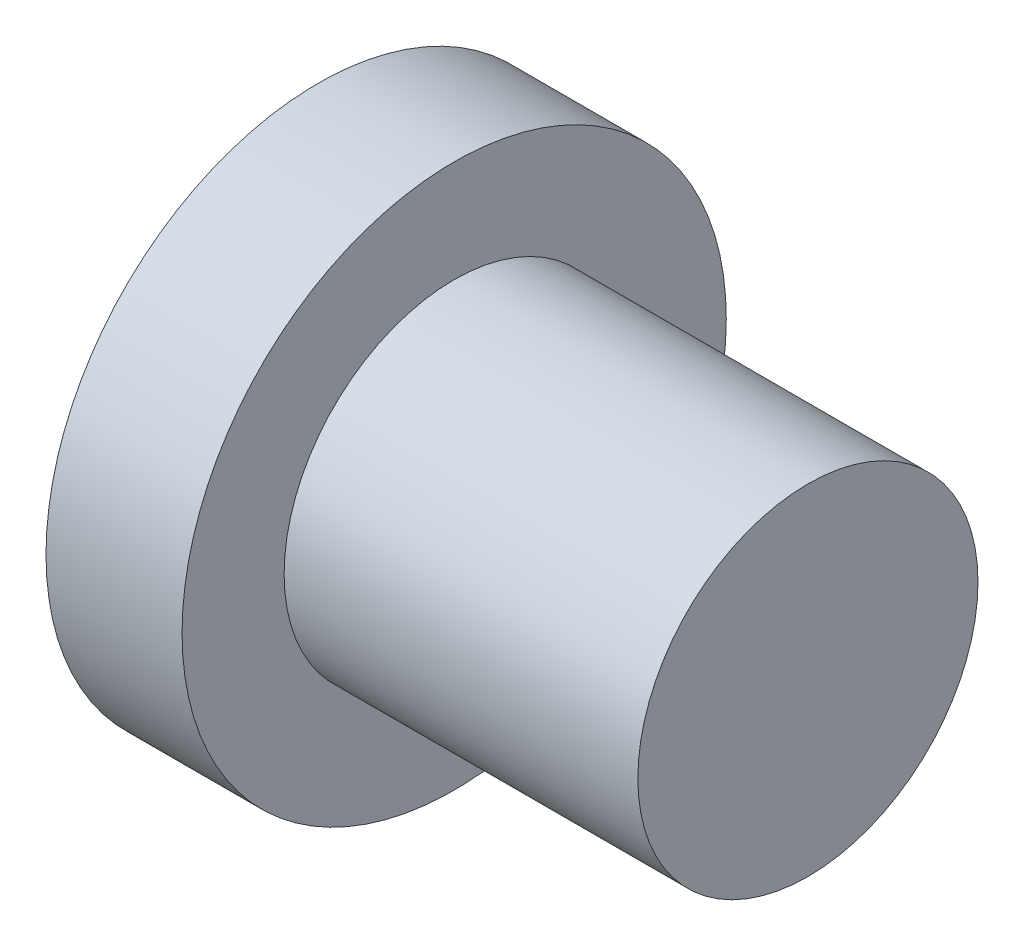
ISO-10303-21;
HEADER;
FILE_DESCRIPTION(('STEP AP214'),'2;1');
FILE_NAME('part.step','',(''),(''),'','','');
FILE_SCHEMA(('AUTOMOTIVE_DESIGN { 1 0 10303 214 1 1 1 1 }'));
ENDSEC;
DATA;
#1=APPLICATION_CONTEXT('core data for automotive mechanical design processes');
#2=APPLICATION_PROTOCOL_DEFINITION('international standard','automotive_design',2000,#1);
#3=PRODUCT_CONTEXT('',#1,'mechanical');
#4=PRODUCT('Part','Part','',(#3));
#5=PRODUCT_RELATED_PRODUCT_CATEGORY('part','',(#4));
#6=PRODUCT_DEFINITION_FORMATION('','',#4);
#7=PRODUCT_DEFINITION_CONTEXT('part definition',#1,'design');
#8=PRODUCT_DEFINITION('design','',#6,#7);
#9=PRODUCT_DEFINITION_SHAPE('','',#8);
#10=(LENGTH_UNIT() NAMED_UNIT(*) SI_UNIT(.MILLI.,.METRE.));
#11=(NAMED_UNIT(*) PLANE_ANGLE_UNIT() SI_UNIT($,.RADIAN.));
#12=(NAMED_UNIT(*) SI_UNIT($,.STERADIAN.) SOLID_ANGLE_UNIT());
#13=UNCERTAINTY_MEASURE_WITH_UNIT(LENGTH_MEASURE(1.E-05),#10,'distance_accuracy_value','');
#14=(GEOMETRIC_REPRESENTATION_CONTEXT(3) GLOBAL_UNCERTAINTY_ASSIGNED_CONTEXT((#13)) GLOBAL_UNIT_ASSIGNED_CONTEXT((#10,
#11,#12)) REPRESENTATION_CONTEXT('',''));
#15=CARTESIAN_POINT('',(0.,0.,0.));
#16=DIRECTION('',(0.,0.,1.));
#17=DIRECTION('',(1.,0.,0.));
#18=AXIS2_PLACEMENT_3D('',#15,#16,#17);
#19=CARTESIAN_POINT('',(10.,0.,0.));
#20=DIRECTION('',(-1.,0.,0.));
#21=DIRECTION('',(0.,0.,1.));
#22=AXIS2_PLACEMENT_3D('',#19,#20,#21);
#23=CYLINDRICAL_SURFACE('',#22,20.);
#24=CARTESIAN_POINT('',(10.,0.,0.));
#25=DIRECTION('',(1.,0.,0.));
#26=DIRECTION('',(0.,0.,-1.));
#27=AXIS2_PLACEMENT_3D('',#24,#25,#26);
#28=CIRCLE('',#27,20.);
#29=CARTESIAN_POINT('',(10.,0.,-20.));
#30=VERTEX_POINT('',#29);
#31=EDGE_CURVE('E46',#30,#30,#28,.T.);
#32=ORIENTED_EDGE('',*,*,#31,.F.);
#33=EDGE_LOOP('',(#32));
#34=FACE_BOUND('',#33,.T.);
#35=CARTESIAN_POINT('',(0.,0.,0.));
#36=DIRECTION('',(1.,0.,0.));
#37=DIRECTION('',(0.,0.,-1.));
#38=AXIS2_PLACEMENT_3D('',#35,#36,#37);
#39=CIRCLE('',#38,20.);
#40=CARTESIAN_POINT('',(0.,0.,-20.));
#41=VERTEX_POINT('',#40);
#42=EDGE_CURVE('E42',#41,#41,#39,.T.);
#43=ORIENTED_EDGE('',*,*,#42,.T.);
#44=EDGE_LOOP('',(#43));
#45=FACE_BOUND('',#44,.T.);
#46=ADVANCED_FACE('F39',(#34,#45),#23,.T.);
#47=CARTESIAN_POINT('',(10.,0.,0.));
#48=DIRECTION('',(1.,0.,0.));
#49=DIRECTION('',(0.,0.,-1.));
#50=AXIS2_PLACEMENT_3D('',#47,#48,#49);
#51=PLANE('',#50);
#52=CARTESIAN_POINT('',(10.,0.,0.));
#53=DIRECTION('',(1.,0.,0.));
#54=DIRECTION('',(0.,0.,-1.));
#55=AXIS2_PLACEMENT_3D('',#52,#53,#54);
#56=CIRCLE('',#55,12.5);
#57=CARTESIAN_POINT('',(10.,0.,12.5));
#58=VERTEX_POINT('',#57);
#59=EDGE_CURVE('E10',#58,#58,#56,.T.);
#60=ORIENTED_EDGE('',*,*,#59,.F.);
#61=EDGE_LOOP('',(#60));
#62=FACE_BOUND('',#61,.T.);
#63=ORIENTED_EDGE('',*,*,#31,.T.);
#64=EDGE_LOOP('',(#63));
#65=FACE_BOUND('',#64,.T.);
#66=ADVANCED_FACE('F63',(#62,#65),#51,.T.);
#67=CARTESIAN_POINT('',(0.,0.,0.));
#68=DIRECTION('',(1.,0.,0.));
#69=DIRECTION('',(0.,0.,-1.));
#70=AXIS2_PLACEMENT_3D('',#67,#68,#69);
#71=PLANE('',#70);
#72=ORIENTED_EDGE('',*,*,#42,.F.);
#73=EDGE_LOOP('',(#72));
#74=FACE_BOUND('',#73,.T.);
#75=ADVANCED_FACE('F60',(#74),#71,.F.);
#76=CARTESIAN_POINT('',(36.,0.,0.));
#77=DIRECTION('',(-1.,0.,0.));
#78=DIRECTION('',(0.,0.,1.));
#79=AXIS2_PLACEMENT_3D('',#76,#77,#78);
#80=CYLINDRICAL_SURFACE('',#79,12.5);
#81=CARTESIAN_POINT('',(36.,0.,0.));
#82=DIRECTION('',(1.,0.,0.));
#83=DIRECTION('',(0.,0.,-1.));
#84=AXIS2_PLACEMENT_3D('',#81,#82,#83);
#85=CIRCLE('',#84,12.5);
#86=CARTESIAN_POINT('',(36.,0.,12.5));
#87=VERTEX_POINT('',#86);
#88=EDGE_CURVE('E52',#87,#87,#85,.T.);
#89=CARTESIAN_POINT('',(36.,0.,12.5));
#90=CARTESIAN_POINT('',(35.7291666666667,0.,12.5));
#91=CARTESIAN_POINT('',(35.4583333333333,0.,12.5));
#92=CARTESIAN_POINT('',(34.9166666666667,0.,12.5));
#93=CARTESIAN_POINT('',(34.6458333333333,0.,12.5));
#94=CARTESIAN_POINT('',(34.1041666666667,0.,12.5));
#95=CARTESIAN_POINT('',(33.8333333333333,0.,12.5));
#96=CARTESIAN_POINT('',(33.2916666666667,0.,12.5));
#97=CARTESIAN_POINT('',(33.0208333333333,0.,12.5));
#98=CARTESIAN_POINT('',(32.4791666666667,0.,12.5));
#99=CARTESIAN_POINT('',(32.2083333333333,0.,12.5));
#100=CARTESIAN_POINT('',(31.6666666666667,0.,12.5));
#101=CARTESIAN_POINT('',(31.3958333333333,0.,12.5));
#102=CARTESIAN_POINT('',(30.8541666666667,0.,12.5));
#103=CARTESIAN_POINT('',(30.5833333333333,0.,12.5));
#104=CARTESIAN_POINT('',(30.0416666666667,0.,12.5));
#105=CARTESIAN_POINT('',(29.7708333333333,0.,12.5));
#106=CARTESIAN_POINT('',(29.2291666666667,0.,12.5));
#107=CARTESIAN_POINT('',(28.9583333333333,0.,12.5));
#108=CARTESIAN_POINT('',(28.4166666666667,0.,12.5));
#109=CARTESIAN_POINT('',(28.1458333333333,0.,12.5));
#110=CARTESIAN_POINT('',(27.6041666666667,0.,12.5));
#111=CARTESIAN_POINT('',(27.3333333333333,0.,12.5));
#112=CARTESIAN_POINT('',(26.7916666666667,0.,12.5));
#113=CARTESIAN_POINT('',(26.5208333333333,0.,12.5));
#114=CARTESIAN_POINT('',(25.9791666666667,0.,12.5));
#115=CARTESIAN_POINT('',(25.7083333333333,0.,12.5));
#116=CARTESIAN_POINT('',(25.1666666666667,0.,12.5));
#117=CARTESIAN_POINT('',(24.8958333333333,0.,12.5));
#118=CARTESIAN_POINT('',(24.3541666666667,0.,12.5));
#119=CARTESIAN_POINT('',(24.0833333333333,0.,12.5));
#120=CARTESIAN_POINT('',(23.5416666666667,0.,12.5));
#121=CARTESIAN_POINT('',(23.2708333333333,0.,12.5));
#122=CARTESIAN_POINT('',(22.7291666666667,0.,12.5));
#123=CARTESIAN_POINT('',(22.4583333333333,0.,12.5));
#124=CARTESIAN_POINT('',(21.9166666666667,0.,12.5));
#125=CARTESIAN_POINT('',(21.6458333333333,0.,12.5));
#126=CARTESIAN_POINT('',(21.1041666666667,0.,12.5));
#127=CARTESIAN_POINT('',(20.8333333333333,0.,12.5));
#128=CARTESIAN_POINT('',(20.2916666666667,0.,12.5));
#129=CARTESIAN_POINT('',(20.0208333333333,0.,12.5));
#130=CARTESIAN_POINT('',(19.4791666666667,0.,12.5));
#131=CARTESIAN_POINT('',(19.2083333333333,0.,12.5));
#132=CARTESIAN_POINT('',(18.6666666666667,0.,12.5));
#133=CARTESIAN_POINT('',(18.3958333333333,0.,12.5));
#134=CARTESIAN_POINT('',(17.8541666666667,0.,12.5));
#135=CARTESIAN_POINT('',(17.5833333333333,0.,12.5));
#136=CARTESIAN_POINT('',(17.0416666666667,0.,12.5));
#137=CARTESIAN_POINT('',(16.7708333333333,0.,12.5));
#138=CARTESIAN_POINT('',(16.2291666666667,0.,12.5));
#139=CARTESIAN_POINT('',(15.9583333333333,0.,12.5));
#140=CARTESIAN_POINT('',(15.4166666666667,0.,12.5));
#141=CARTESIAN_POINT('',(15.1458333333333,0.,12.5));
#142=CARTESIAN_POINT('',(14.6041666666667,0.,12.5));
#143=CARTESIAN_POINT('',(14.3333333333333,0.,12.5));
#144=CARTESIAN_POINT('',(13.7916666666667,0.,12.5));
#145=CARTESIAN_POINT('',(13.5208333333333,0.,12.5));
#146=CARTESIAN_POINT('',(12.9791666666667,0.,12.5));
#147=CARTESIAN_POINT('',(12.7083333333333,0.,12.5));
#148=CARTESIAN_POINT('',(12.1666666666667,0.,12.5));
#149=CARTESIAN_POINT('',(11.8958333333333,0.,12.5));
#150=CARTESIAN_POINT('',(11.3541666666667,0.,12.5));
#151=CARTESIAN_POINT('',(11.0833333333333,0.,12.5));
#152=CARTESIAN_POINT('',(10.5416666666667,0.,12.5));
#153=CARTESIAN_POINT('',(10.2708333333333,0.,12.5));
#154=CARTESIAN_POINT('',(10.,0.,12.5));
#155=B_SPLINE_CURVE_WITH_KNOTS('',3,(#89,#90,#91,#92,#93,#94,#95,#96,#97,#98,#99,#100,#101,#102,
#103,#104,#105,#106,#107,#108,#109,#110,#111,#112,#113,#114,#115,#116,#117,#118,#119,#120,#121,
#122,#123,#124,#125,#126,#127,#128,#129,#130,#131,#132,#133,#134,#135,#136,#137,#138,#139,#140,
#141,#142,#143,#144,#145,#146,#147,#148,#149,#150,#151,#152,#153,#154),.UNSPECIFIED.,.F.,.F.,(4,
2,2,2,2,2,2,2,2,2,2,2,2,2,2,2,2,2,2,2,2,2,2,2,2,2,2,2,2,2,2,2,4),(0.,0.812500000000001,1.625,
2.4375,3.25,4.0625,4.875,5.6875,6.5,7.3125,8.125,8.9375,9.75,10.5625,11.375,12.1875,13.,13.8125,
14.625,15.4375,16.25,17.0625,17.875,18.6875,19.5,20.3125,21.125,21.9375,22.75,23.5625,24.375,
25.1875,26.),.UNSPECIFIED.);
#156=EDGE_CURVE('BSEAM62',#87,#58,#155,.T.);
#157=ORIENTED_EDGE('',*,*,#88,.F.);
#158=ORIENTED_EDGE('',*,*,#59,.T.);
#159=ORIENTED_EDGE('',*,*,#156,.T.);
#160=ORIENTED_EDGE('',*,*,#156,.F.);
#161=EDGE_LOOP('',(#157,#159,#158,#160));
#162=FACE_BOUND('',#161,.T.);
#163=ADVANCED_FACE('F62',(#162),#80,.T.);
#164=CARTESIAN_POINT('',(36.,0.,0.));
#165=DIRECTION('',(1.,0.,0.));
#166=DIRECTION('',(0.,0.,-1.));
#167=AXIS2_PLACEMENT_3D('',#164,#165,#166);
#168=PLANE('',#167);
#169=ORIENTED_EDGE('',*,*,#88,.T.);
#170=EDGE_LOOP('',(#169));
#171=FACE_BOUND('',#170,.T.);
#172=ADVANCED_FACE('F69',(#171),#168,.T.);
#173=CLOSED_SHELL('',(#46,#66,#75,#163,#172));
#174=MANIFOLD_SOLID_BREP('B2',#173);
#175=ADVANCED_BREP_SHAPE_REPRESENTATION('',(#18,#174),#14);
#176=SHAPE_DEFINITION_REPRESENTATION(#9,#175);
ENDSEC;
END-ISO-10303-21;
